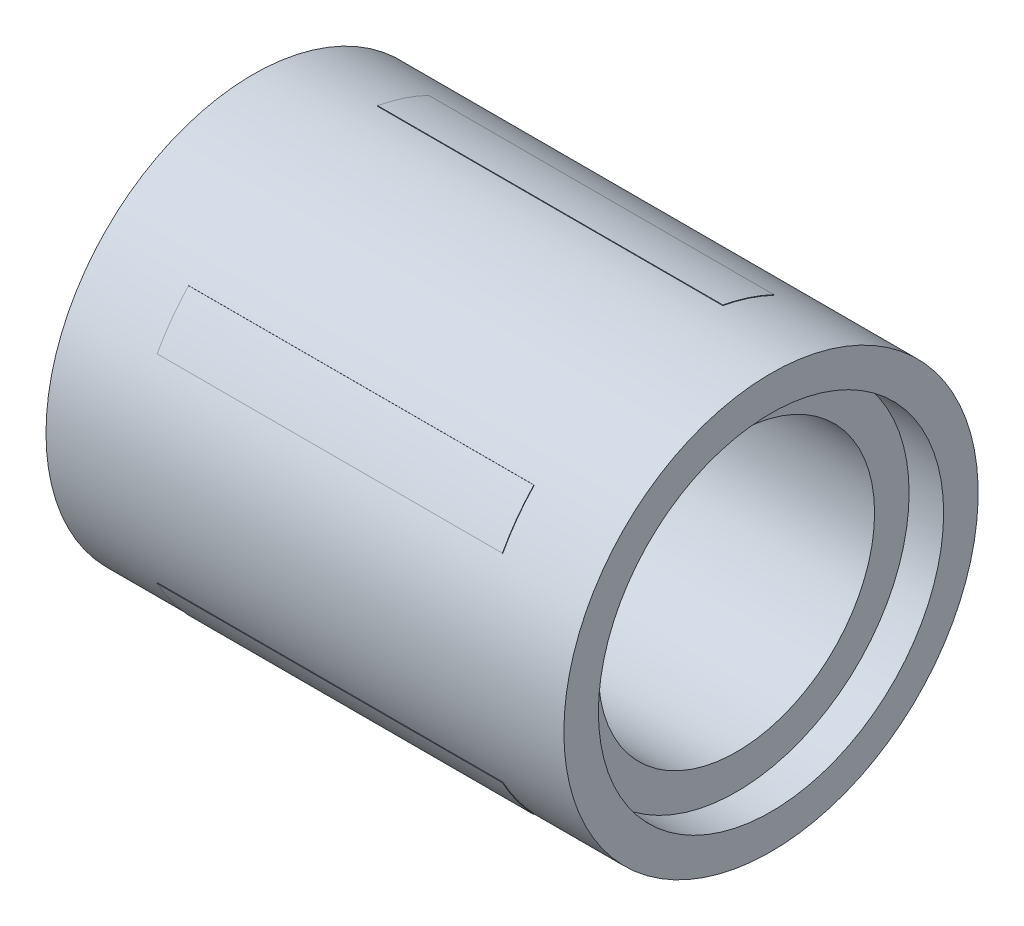
ISO-10303-21;
HEADER;
FILE_DESCRIPTION(('STEP AP214'),'2;1');
FILE_NAME('part.step','',(''),(''),'','','');
FILE_SCHEMA(('AUTOMOTIVE_DESIGN { 1 0 10303 214 1 1 1 1 }'));
ENDSEC;
DATA;
#1=APPLICATION_CONTEXT('core data for automotive mechanical design processes');
#2=APPLICATION_PROTOCOL_DEFINITION('international standard','automotive_design',2000,#1);
#3=PRODUCT_CONTEXT('',#1,'mechanical');
#4=PRODUCT('Part','Part','',(#3));
#5=PRODUCT_RELATED_PRODUCT_CATEGORY('part','',(#4));
#6=PRODUCT_DEFINITION_FORMATION('','',#4);
#7=PRODUCT_DEFINITION_CONTEXT('part definition',#1,'design');
#8=PRODUCT_DEFINITION('design','',#6,#7);
#9=PRODUCT_DEFINITION_SHAPE('','',#8);
#10=(LENGTH_UNIT() NAMED_UNIT(*) SI_UNIT(.MILLI.,.METRE.));
#11=(NAMED_UNIT(*) PLANE_ANGLE_UNIT() SI_UNIT($,.RADIAN.));
#12=(NAMED_UNIT(*) SI_UNIT($,.STERADIAN.) SOLID_ANGLE_UNIT());
#13=UNCERTAINTY_MEASURE_WITH_UNIT(LENGTH_MEASURE(1.E-05),#10,'distance_accuracy_value','');
#14=(GEOMETRIC_REPRESENTATION_CONTEXT(3) GLOBAL_UNCERTAINTY_ASSIGNED_CONTEXT((#13)) GLOBAL_UNIT_ASSIGNED_CONTEXT((#10,
#11,#12)) REPRESENTATION_CONTEXT('',''));
#15=CARTESIAN_POINT('',(0.,0.,0.));
#16=DIRECTION('',(0.,0.,1.));
#17=DIRECTION('',(1.,0.,0.));
#18=AXIS2_PLACEMENT_3D('',#15,#16,#17);
#19=CARTESIAN_POINT('',(-15.,12.,0.));
#20=DIRECTION('',(1.,0.,0.));
#21=DIRECTION('',(0.,0.,-1.));
#22=AXIS2_PLACEMENT_3D('',#19,#20,#21);
#23=PLANE('',#22);
#24=CARTESIAN_POINT('',(-15.,0.,0.));
#25=DIRECTION('',(-1.,0.,0.));
#26=DIRECTION('',(0.,0.,1.));
#27=AXIS2_PLACEMENT_3D('',#24,#25,#26);
#28=CIRCLE('',#27,10.);
#29=CARTESIAN_POINT('',(-15.,0.,10.));
#30=VERTEX_POINT('',#29);
#31=EDGE_CURVE('E302',#30,#30,#28,.T.);
#32=ORIENTED_EDGE('',*,*,#31,.F.);
#33=EDGE_LOOP('',(#32));
#34=FACE_BOUND('',#33,.T.);
#35=CARTESIAN_POINT('',(-15.,0.,0.));
#36=DIRECTION('',(-1.,0.,0.));
#37=DIRECTION('',(0.,0.,1.));
#38=AXIS2_PLACEMENT_3D('',#35,#36,#37);
#39=CIRCLE('',#38,12.);
#40=CARTESIAN_POINT('',(-15.,0.,12.));
#41=VERTEX_POINT('',#40);
#42=EDGE_CURVE('E185',#41,#41,#39,.T.);
#43=ORIENTED_EDGE('',*,*,#42,.T.);
#44=EDGE_LOOP('',(#43));
#45=FACE_BOUND('',#44,.T.);
#46=ADVANCED_FACE('F33',(#34,#45),#23,.F.);
#47=CARTESIAN_POINT('',(15.,0.,0.));
#48=DIRECTION('',(-1.,0.,0.));
#49=DIRECTION('',(0.,0.,1.));
#50=AXIS2_PLACEMENT_3D('',#47,#48,#49);
#51=CYLINDRICAL_SURFACE('',#50,10.);
#52=CARTESIAN_POINT('',(-13.,0.,0.));
#53=DIRECTION('',(-1.,0.,0.));
#54=DIRECTION('',(0.,0.,1.));
#55=AXIS2_PLACEMENT_3D('',#52,#53,#54);
#56=CIRCLE('',#55,10.);
#57=CARTESIAN_POINT('',(-13.,0.,10.));
#58=VERTEX_POINT('',#57);
#59=EDGE_CURVE('E299',#58,#58,#56,.T.);
#60=ORIENTED_EDGE('',*,*,#59,.F.);
#61=EDGE_LOOP('',(#60));
#62=FACE_BOUND('',#61,.T.);
#63=ORIENTED_EDGE('',*,*,#31,.T.);
#64=EDGE_LOOP('',(#63));
#65=FACE_BOUND('',#64,.T.);
#66=ADVANCED_FACE('F390',(#62,#65),#51,.F.);
#67=CARTESIAN_POINT('',(-13.,10.,0.));
#68=DIRECTION('',(1.,0.,0.));
#69=DIRECTION('',(0.,0.,-1.));
#70=AXIS2_PLACEMENT_3D('',#67,#68,#69);
#71=PLANE('',#70);
#72=CARTESIAN_POINT('',(-13.,0.,0.));
#73=DIRECTION('',(-1.,0.,0.));
#74=DIRECTION('',(0.,0.,1.));
#75=AXIS2_PLACEMENT_3D('',#72,#73,#74);
#76=CIRCLE('',#75,8.);
#77=CARTESIAN_POINT('',(-13.,0.,8.));
#78=VERTEX_POINT('',#77);
#79=EDGE_CURVE('E296',#78,#78,#76,.T.);
#80=ORIENTED_EDGE('',*,*,#79,.F.);
#81=EDGE_LOOP('',(#80));
#82=FACE_BOUND('',#81,.T.);
#83=ORIENTED_EDGE('',*,*,#59,.T.);
#84=EDGE_LOOP('',(#83));
#85=FACE_BOUND('',#84,.T.);
#86=ADVANCED_FACE('F395',(#82,#85),#71,.F.);
#87=CARTESIAN_POINT('',(15.,0.,0.));
#88=DIRECTION('',(-1.,0.,0.));
#89=DIRECTION('',(0.,0.,1.));
#90=AXIS2_PLACEMENT_3D('',#87,#88,#89);
#91=CYLINDRICAL_SURFACE('',#90,8.);
#92=CARTESIAN_POINT('',(13.,0.,0.));
#93=DIRECTION('',(-1.,0.,0.));
#94=DIRECTION('',(0.,0.,1.));
#95=AXIS2_PLACEMENT_3D('',#92,#93,#94);
#96=CIRCLE('',#95,8.);
#97=CARTESIAN_POINT('',(13.,0.,8.));
#98=VERTEX_POINT('',#97);
#99=EDGE_CURVE('E293',#98,#98,#96,.T.);
#100=ORIENTED_EDGE('',*,*,#99,.F.);
#101=EDGE_LOOP('',(#100));
#102=FACE_BOUND('',#101,.T.);
#103=ORIENTED_EDGE('',*,*,#79,.T.);
#104=EDGE_LOOP('',(#103));
#105=FACE_BOUND('',#104,.T.);
#106=ADVANCED_FACE('F422',(#102,#105),#91,.F.);
#107=CARTESIAN_POINT('',(13.,8.,0.));
#108=DIRECTION('',(-1.,0.,0.));
#109=DIRECTION('',(0.,0.,1.));
#110=AXIS2_PLACEMENT_3D('',#107,#108,#109);
#111=PLANE('',#110);
#112=CARTESIAN_POINT('',(13.,0.,0.));
#113=DIRECTION('',(-1.,0.,0.));
#114=DIRECTION('',(0.,0.,1.));
#115=AXIS2_PLACEMENT_3D('',#112,#113,#114);
#116=CIRCLE('',#115,10.);
#117=CARTESIAN_POINT('',(13.,0.,10.));
#118=VERTEX_POINT('',#117);
#119=EDGE_CURVE('E290',#118,#118,#116,.T.);
#120=ORIENTED_EDGE('',*,*,#119,.F.);
#121=EDGE_LOOP('',(#120));
#122=FACE_BOUND('',#121,.T.);
#123=ORIENTED_EDGE('',*,*,#99,.T.);
#124=EDGE_LOOP('',(#123));
#125=FACE_BOUND('',#124,.T.);
#126=ADVANCED_FACE('F416',(#122,#125),#111,.F.);
#127=CARTESIAN_POINT('',(15.,0.,0.));
#128=DIRECTION('',(-1.,0.,0.));
#129=DIRECTION('',(0.,0.,1.));
#130=AXIS2_PLACEMENT_3D('',#127,#128,#129);
#131=CYLINDRICAL_SURFACE('',#130,10.);
#132=CARTESIAN_POINT('',(15.,0.,0.));
#133=DIRECTION('',(-1.,0.,0.));
#134=DIRECTION('',(0.,0.,1.));
#135=AXIS2_PLACEMENT_3D('',#132,#133,#134);
#136=CIRCLE('',#135,10.);
#137=CARTESIAN_POINT('',(15.,0.,10.));
#138=VERTEX_POINT('',#137);
#139=EDGE_CURVE('E287',#138,#138,#136,.T.);
#140=ORIENTED_EDGE('',*,*,#139,.F.);
#141=EDGE_LOOP('',(#140));
#142=FACE_BOUND('',#141,.T.);
#143=ORIENTED_EDGE('',*,*,#119,.T.);
#144=EDGE_LOOP('',(#143));
#145=FACE_BOUND('',#144,.T.);
#146=ADVANCED_FACE('F410',(#142,#145),#131,.F.);
#147=CARTESIAN_POINT('',(15.,10.,0.));
#148=DIRECTION('',(-1.,0.,0.));
#149=DIRECTION('',(0.,0.,1.));
#150=AXIS2_PLACEMENT_3D('',#147,#148,#149);
#151=PLANE('',#150);
#152=CARTESIAN_POINT('',(15.,0.,0.));
#153=DIRECTION('',(-1.,0.,0.));
#154=DIRECTION('',(0.,0.,1.));
#155=AXIS2_PLACEMENT_3D('',#152,#153,#154);
#156=CIRCLE('',#155,12.);
#157=CARTESIAN_POINT('',(15.,0.,12.));
#158=VERTEX_POINT('',#157);
#159=EDGE_CURVE('E284',#158,#158,#156,.T.);
#160=ORIENTED_EDGE('',*,*,#159,.F.);
#161=EDGE_LOOP('',(#160));
#162=FACE_BOUND('',#161,.T.);
#163=ORIENTED_EDGE('',*,*,#139,.T.);
#164=EDGE_LOOP('',(#163));
#165=FACE_BOUND('',#164,.T.);
#166=ADVANCED_FACE('F404',(#162,#165),#151,.F.);
#167=CARTESIAN_POINT('',(15.,0.,0.));
#168=DIRECTION('',(-1.,0.,0.));
#169=DIRECTION('',(0.,0.,1.));
#170=AXIS2_PLACEMENT_3D('',#167,#168,#169);
#171=CYLINDRICAL_SURFACE('',#170,12.);
#172=DIRECTION('',(-1.,0.,0.));
#173=VECTOR('',#172,1.);
#174=CARTESIAN_POINT('',(15.,10.838096687135,-5.15127753089604));
#175=LINE('',#174,#173);
#176=CARTESIAN_POINT('',(10.,10.838096687135,-5.15127753089604));
#177=VERTEX_POINT('',#176);
#178=CARTESIAN_POINT('',(-10.,10.838096687135,-5.15127753089604));
#179=VERTEX_POINT('',#178);
#180=EDGE_CURVE('E36',#177,#179,#175,.T.);
#181=ORIENTED_EDGE('',*,*,#180,.F.);
#182=CARTESIAN_POINT('',(10.,0.,0.));
#183=DIRECTION('',(1.,0.,0.));
#184=DIRECTION('',(0.,0.,-1.));
#185=AXIS2_PLACEMENT_3D('',#182,#183,#184);
#186=CIRCLE('',#185,12.);
#187=CARTESIAN_POINT('',(10.,11.7960493696973,-2.20300233038115));
#188=VERTEX_POINT('',#187);
#189=EDGE_CURVE('E11',#177,#188,#186,.T.);
#190=ORIENTED_EDGE('',*,*,#189,.T.);
#191=DIRECTION('',(-1.,0.,0.));
#192=VECTOR('',#191,1.);
#193=CARTESIAN_POINT('',(15.,11.7960493696973,-2.20300233038115));
#194=LINE('',#193,#192);
#195=CARTESIAN_POINT('',(-10.,11.7960493696973,-2.20300233038115));
#196=VERTEX_POINT('',#195);
#197=EDGE_CURVE('E335',#196,#188,#194,.F.);
#198=ORIENTED_EDGE('',*,*,#197,.F.);
#199=CARTESIAN_POINT('',(-10.,0.,0.));
#200=DIRECTION('',(1.,0.,0.));
#201=DIRECTION('',(0.,0.,-1.));
#202=AXIS2_PLACEMENT_3D('',#199,#200,#201);
#203=CIRCLE('',#202,12.);
#204=EDGE_CURVE('E309',#179,#196,#203,.T.);
#205=ORIENTED_EDGE('',*,*,#204,.F.);
#206=EDGE_LOOP('',(#181,#190,#198,#205));
#207=FACE_BOUND('',#206,.T.);
#208=DIRECTION('',(-1.,0.,0.));
#209=VECTOR('',#208,1.);
#210=CARTESIAN_POINT('',(15.,8.24831212600703,8.7158101787479));
#211=LINE('',#210,#209);
#212=CARTESIAN_POINT('',(10.,8.24831212600703,8.7158101787479));
#213=VERTEX_POINT('',#212);
#214=CARTESIAN_POINT('',(-10.,8.24831212600703,8.7158101787479));
#215=VERTEX_POINT('',#214);
#216=EDGE_CURVE('E332',#213,#215,#211,.T.);
#217=ORIENTED_EDGE('',*,*,#216,.F.);
#218=CARTESIAN_POINT('',(10.,5.74035944344453,10.5379444608546));
#219=VERTEX_POINT('',#218);
#220=EDGE_CURVE('E42',#213,#219,#186,.T.);
#221=ORIENTED_EDGE('',*,*,#220,.T.);
#222=DIRECTION('',(-1.,0.,0.));
#223=VECTOR('',#222,1.);
#224=CARTESIAN_POINT('',(15.,5.74035944344453,10.5379444608546));
#225=LINE('',#224,#223);
#226=CARTESIAN_POINT('',(-10.,5.74035944344453,10.5379444608546));
#227=VERTEX_POINT('',#226);
#228=EDGE_CURVE('E329',#227,#219,#225,.F.);
#229=ORIENTED_EDGE('',*,*,#228,.F.);
#230=EDGE_CURVE('E333',#215,#227,#203,.T.);
#231=ORIENTED_EDGE('',*,*,#230,.F.);
#232=EDGE_LOOP('',(#217,#221,#229,#231));
#233=FACE_BOUND('',#232,.T.);
#234=DIRECTION('',(-1.,0.,0.));
#235=VECTOR('',#234,1.);
#236=CARTESIAN_POINT('',(15.,-5.74035944344453,10.5379444608546));
#237=LINE('',#236,#235);
#238=CARTESIAN_POINT('',(10.,-5.74035944344453,10.5379444608546));
#239=VERTEX_POINT('',#238);
#240=CARTESIAN_POINT('',(-10.,-5.74035944344453,10.5379444608546));
#241=VERTEX_POINT('',#240);
#242=EDGE_CURVE('E174',#239,#241,#237,.T.);
#243=ORIENTED_EDGE('',*,*,#242,.F.);
#244=CARTESIAN_POINT('',(10.,-8.24831212600703,8.7158101787479));
#245=VERTEX_POINT('',#244);
#246=EDGE_CURVE('E328',#239,#245,#186,.T.);
#247=ORIENTED_EDGE('',*,*,#246,.T.);
#248=DIRECTION('',(-1.,0.,0.));
#249=VECTOR('',#248,1.);
#250=CARTESIAN_POINT('',(15.,-8.24831212600703,8.7158101787479));
#251=LINE('',#250,#249);
#252=CARTESIAN_POINT('',(-10.,-8.24831212600703,8.7158101787479));
#253=VERTEX_POINT('',#252);
#254=EDGE_CURVE('E323',#253,#245,#251,.F.);
#255=ORIENTED_EDGE('',*,*,#254,.F.);
#256=EDGE_CURVE('E326',#241,#253,#203,.T.);
#257=ORIENTED_EDGE('',*,*,#256,.F.);
#258=EDGE_LOOP('',(#243,#247,#255,#257));
#259=FACE_BOUND('',#258,.T.);
#260=DIRECTION('',(-1.,0.,0.));
#261=VECTOR('',#260,1.);
#262=CARTESIAN_POINT('',(15.,-11.7960493696973,-2.20300233038115));
#263=LINE('',#262,#261);
#264=CARTESIAN_POINT('',(10.,-11.7960493696973,-2.20300233038115));
#265=VERTEX_POINT('',#264);
#266=CARTESIAN_POINT('',(-10.,-11.7960493696973,-2.20300233038115));
#267=VERTEX_POINT('',#266);
#268=EDGE_CURVE('E320',#265,#267,#263,.T.);
#269=ORIENTED_EDGE('',*,*,#268,.F.);
#270=CARTESIAN_POINT('',(10.,-10.838096687135,-5.15127753089604));
#271=VERTEX_POINT('',#270);
#272=EDGE_CURVE('E316',#265,#271,#186,.T.);
#273=ORIENTED_EDGE('',*,*,#272,.T.);
#274=DIRECTION('',(-1.,0.,0.));
#275=VECTOR('',#274,1.);
#276=CARTESIAN_POINT('',(15.,-10.838096687135,-5.15127753089604));
#277=LINE('',#276,#275);
#278=CARTESIAN_POINT('',(-10.,-10.838096687135,-5.15127753089604));
#279=VERTEX_POINT('',#278);
#280=EDGE_CURVE('E317',#279,#271,#277,.F.);
#281=ORIENTED_EDGE('',*,*,#280,.F.);
#282=EDGE_CURVE('E310',#267,#279,#203,.T.);
#283=ORIENTED_EDGE('',*,*,#282,.F.);
#284=EDGE_LOOP('',(#269,#273,#281,#283));
#285=FACE_BOUND('',#284,.T.);
#286=DIRECTION('',(-1.,0.,0.));
#287=VECTOR('',#286,1.);
#288=CARTESIAN_POINT('',(15.,-1.55,-11.8994747783253));
#289=LINE('',#288,#287);
#290=CARTESIAN_POINT('',(10.,-1.55,-11.8994747783253));
#291=VERTEX_POINT('',#290);
#292=CARTESIAN_POINT('',(-10.,-1.55,-11.8994747783253));
#293=VERTEX_POINT('',#292);
#294=EDGE_CURVE('E313',#291,#293,#289,.T.);
#295=ORIENTED_EDGE('',*,*,#294,.F.);
#296=CARTESIAN_POINT('',(10.,1.55,-11.8994747783253));
#297=VERTEX_POINT('',#296);
#298=EDGE_CURVE('E43',#291,#297,#186,.T.);
#299=ORIENTED_EDGE('',*,*,#298,.T.);
#300=DIRECTION('',(-1.,0.,0.));
#301=VECTOR('',#300,1.);
#302=CARTESIAN_POINT('',(15.,1.55,-11.8994747783253));
#303=LINE('',#302,#301);
#304=CARTESIAN_POINT('',(-10.,1.55,-11.8994747783253));
#305=VERTEX_POINT('',#304);
#306=EDGE_CURVE('E308',#305,#297,#303,.F.);
#307=ORIENTED_EDGE('',*,*,#306,.F.);
#308=EDGE_CURVE('E305',#293,#305,#203,.T.);
#309=ORIENTED_EDGE('',*,*,#308,.F.);
#310=EDGE_LOOP('',(#295,#299,#307,#309));
#311=FACE_BOUND('',#310,.T.);
#312=ORIENTED_EDGE('',*,*,#42,.F.);
#313=EDGE_LOOP('',(#312));
#314=FACE_BOUND('',#313,.T.);
#315=ORIENTED_EDGE('',*,*,#159,.T.);
#316=EDGE_LOOP('',(#315));
#317=FACE_BOUND('',#316,.T.);
#318=ADVANCED_FACE('F365',(#207,#233,#259,#285,#311,#314,#317),#171,.T.);
#319=CARTESIAN_POINT('',(10.,0.,-2.79984369022657E-12));
#320=DIRECTION('',(-1.,0.,0.));
#321=DIRECTION('',(0.,0.,1.));
#322=AXIS2_PLACEMENT_3D('',#319,#320,#321);
#323=CYLINDRICAL_SURFACE('',#322,12.0299999999971);
#324=DIRECTION('',(-1.,0.,0.));
#325=VECTOR('',#324,1.);
#326=CARTESIAN_POINT('',(10.,-1.55000000000001,-11.929727574425));
#327=LINE('',#326,#325);
#328=CARTESIAN_POINT('',(10.,-1.55000000000001,-11.929727574425));
#329=VERTEX_POINT('',#328);
#330=CARTESIAN_POINT('',(-10.,-1.55000000000001,-11.929727574425));
#331=VERTEX_POINT('',#330);
#332=EDGE_CURVE('E273',#329,#331,#327,.T.);
#333=ORIENTED_EDGE('',*,*,#332,.T.);
#334=CARTESIAN_POINT('',(-10.,0.,-2.79984369022657E-12));
#335=DIRECTION('',(1.,0.,0.));
#336=DIRECTION('',(0.,0.,-1.));
#337=AXIS2_PLACEMENT_3D('',#334,#335,#336);
#338=CIRCLE('',#337,12.0299999999971);
#339=CARTESIAN_POINT('',(-10.,1.55,-11.929727574425));
#340=VERTEX_POINT('',#339);
#341=EDGE_CURVE('E205',#331,#340,#338,.T.);
#342=ORIENTED_EDGE('',*,*,#341,.T.);
#343=DIRECTION('',(-1.,0.,0.));
#344=VECTOR('',#343,1.);
#345=CARTESIAN_POINT('',(10.,1.55,-11.929727574425));
#346=LINE('',#345,#344);
#347=CARTESIAN_POINT('',(10.,1.55,-11.929727574425));
#348=VERTEX_POINT('',#347);
#349=EDGE_CURVE('E271',#348,#340,#346,.T.);
#350=ORIENTED_EDGE('',*,*,#349,.F.);
#351=CARTESIAN_POINT('',(10.,0.,-2.79984369022657E-12));
#352=DIRECTION('',(1.,0.,0.));
#353=DIRECTION('',(0.,0.,-1.));
#354=AXIS2_PLACEMENT_3D('',#351,#352,#353);
#355=CIRCLE('',#354,12.0299999999971);
#356=EDGE_CURVE('E242',#329,#348,#355,.T.);
#357=ORIENTED_EDGE('',*,*,#356,.F.);
#358=EDGE_LOOP('',(#333,#342,#350,#357));
#359=FACE_BOUND('',#358,.T.);
#360=ADVANCED_FACE('F403',(#359),#323,.T.);
#361=CARTESIAN_POINT('',(-10.,0.,-2.79984369022657E-12));
#362=DIRECTION('',(1.,0.,0.));
#363=DIRECTION('',(0.,0.,-1.));
#364=AXIS2_PLACEMENT_3D('',#361,#362,#363);
#365=PLANE('',#364);
#366=DIRECTION('',(0.,0.,-1.));
#367=VECTOR('',#366,1.);
#368=CARTESIAN_POINT('',(-10.,-1.55,-11.395064721185));
#369=LINE('',#368,#367);
#370=EDGE_CURVE('E203',#293,#331,#369,.T.);
#371=ORIENTED_EDGE('',*,*,#370,.F.);
#372=ORIENTED_EDGE('',*,*,#308,.T.);
#373=DIRECTION('',(0.,0.,1.));
#374=VECTOR('',#373,1.);
#375=CARTESIAN_POINT('',(-10.,1.55,-11.929727574425));
#376=LINE('',#375,#374);
#377=EDGE_CURVE('E208',#340,#305,#376,.T.);
#378=ORIENTED_EDGE('',*,*,#377,.F.);
#379=ORIENTED_EDGE('',*,*,#341,.F.);
#380=EDGE_LOOP('',(#371,#372,#378,#379));
#381=FACE_BOUND('',#380,.T.);
#382=ADVANCED_FACE('F455',(#381),#365,.F.);
#383=CARTESIAN_POINT('',(10.,1.55,-11.929727574425));
#384=DIRECTION('',(0.,-1.,0.));
#385=DIRECTION('',(0.,0.,-1.));
#386=AXIS2_PLACEMENT_3D('',#383,#384,#385);
#387=PLANE('',#386);
#388=ORIENTED_EDGE('',*,*,#377,.T.);
#389=ORIENTED_EDGE('',*,*,#306,.T.);
#390=DIRECTION('',(0.,0.,1.));
#391=VECTOR('',#390,1.);
#392=CARTESIAN_POINT('',(10.,1.55,-11.929727574425));
#393=LINE('',#392,#391);
#394=EDGE_CURVE('E244',#348,#297,#393,.T.);
#395=ORIENTED_EDGE('',*,*,#394,.F.);
#396=ORIENTED_EDGE('',*,*,#349,.T.);
#397=EDGE_LOOP('',(#388,#389,#395,#396));
#398=FACE_BOUND('',#397,.T.);
#399=ADVANCED_FACE('F451',(#398),#387,.F.);
#400=CARTESIAN_POINT('',(10.,-1.55,-11.395064721185));
#401=DIRECTION('',(0.,1.,0.));
#402=DIRECTION('',(0.,0.,1.));
#403=AXIS2_PLACEMENT_3D('',#400,#401,#402);
#404=PLANE('',#403);
#405=DIRECTION('',(0.,0.,-1.));
#406=VECTOR('',#405,1.);
#407=CARTESIAN_POINT('',(10.,-1.55,-11.395064721185));
#408=LINE('',#407,#406);
#409=EDGE_CURVE('E240',#291,#329,#408,.T.);
#410=ORIENTED_EDGE('',*,*,#409,.F.);
#411=ORIENTED_EDGE('',*,*,#294,.T.);
#412=ORIENTED_EDGE('',*,*,#370,.T.);
#413=ORIENTED_EDGE('',*,*,#332,.F.);
#414=EDGE_LOOP('',(#410,#411,#412,#413));
#415=FACE_BOUND('',#414,.T.);
#416=ADVANCED_FACE('F382',(#415),#404,.F.);
#417=CARTESIAN_POINT('',(10.,0.,-2.79984369022657E-12));
#418=DIRECTION('',(1.,0.,0.));
#419=DIRECTION('',(0.,0.,-1.));
#420=AXIS2_PLACEMENT_3D('',#417,#418,#419);
#421=PLANE('',#420);
#422=ORIENTED_EDGE('',*,*,#298,.F.);
#423=ORIENTED_EDGE('',*,*,#409,.T.);
#424=ORIENTED_EDGE('',*,*,#356,.T.);
#425=ORIENTED_EDGE('',*,*,#394,.T.);
#426=EDGE_LOOP('',(#422,#423,#424,#425));
#427=FACE_BOUND('',#426,.T.);
#428=ADVANCED_FACE('F371',(#427),#421,.T.);
#429=CARTESIAN_POINT('',(10.,0.,-2.79984369022657E-12));
#430=DIRECTION('',(-1.,0.,0.));
#431=DIRECTION('',(0.,0.,1.));
#432=AXIS2_PLACEMENT_3D('',#429,#430,#431);
#433=CYLINDRICAL_SURFACE('',#432,12.0299999999991);
#434=DIRECTION('',(-1.,0.,0.));
#435=VECTOR('',#434,1.);
#436=CARTESIAN_POINT('',(10.,-11.8248214885638,-2.21235095850326));
#437=LINE('',#436,#435);
#438=CARTESIAN_POINT('',(10.,-11.8248214885638,-2.21235095850326));
#439=VERTEX_POINT('',#438);
#440=CARTESIAN_POINT('',(-10.,-11.8248214885638,-2.21235095850326));
#441=VERTEX_POINT('',#440);
#442=EDGE_CURVE('E278',#439,#441,#437,.T.);
#443=ORIENTED_EDGE('',*,*,#442,.T.);
#444=CARTESIAN_POINT('',(-10.,0.,-2.79984369022657E-12));
#445=DIRECTION('',(1.,0.,0.));
#446=DIRECTION('',(0.,0.,-1.));
#447=AXIS2_PLACEMENT_3D('',#444,#445,#446);
#448=CIRCLE('',#447,12.0299999999991);
#449=CARTESIAN_POINT('',(-10.,-10.866868806002,-5.1606261590183));
#450=VERTEX_POINT('',#449);
#451=EDGE_CURVE('E197',#441,#450,#448,.T.);
#452=ORIENTED_EDGE('',*,*,#451,.T.);
#453=DIRECTION('',(-1.,0.,0.));
#454=VECTOR('',#453,1.);
#455=CARTESIAN_POINT('',(10.,-10.866868806002,-5.1606261590183));
#456=LINE('',#455,#454);
#457=CARTESIAN_POINT('',(10.,-10.866868806002,-5.1606261590183));
#458=VERTEX_POINT('',#457);
#459=EDGE_CURVE('E276',#458,#450,#456,.T.);
#460=ORIENTED_EDGE('',*,*,#459,.F.);
#461=CARTESIAN_POINT('',(10.,0.,-2.79984369022657E-12));
#462=DIRECTION('',(1.,0.,0.));
#463=DIRECTION('',(0.,0.,-1.));
#464=AXIS2_PLACEMENT_3D('',#461,#462,#463);
#465=CIRCLE('',#464,12.0299999999991);
#466=EDGE_CURVE('E235',#439,#458,#465,.T.);
#467=ORIENTED_EDGE('',*,*,#466,.F.);
#468=EDGE_LOOP('',(#443,#452,#460,#467));
#469=FACE_BOUND('',#468,.T.);
#470=ADVANCED_FACE('F359',(#469),#433,.T.);
#471=DIRECTION('',(0.,-0.95105651629521,-0.309016994374772));
#472=VECTOR('',#471,1.);
#473=CARTESIAN_POINT('',(-10.,-11.316326897969,-2.0471310505912));
#474=LINE('',#473,#472);
#475=EDGE_CURVE('E193',#267,#441,#474,.T.);
#476=ORIENTED_EDGE('',*,*,#475,.F.);
#477=ORIENTED_EDGE('',*,*,#282,.T.);
#478=DIRECTION('',(0.,0.951056516295156,0.309016994374941));
#479=VECTOR('',#478,1.);
#480=CARTESIAN_POINT('',(-10.,-10.866868806002,-5.1606261590183));
#481=LINE('',#480,#479);
#482=EDGE_CURVE('E200',#450,#279,#481,.T.);
#483=ORIENTED_EDGE('',*,*,#482,.F.);
#484=ORIENTED_EDGE('',*,*,#451,.F.);
#485=EDGE_LOOP('',(#476,#477,#483,#484));
#486=FACE_BOUND('',#485,.T.);
#487=ADVANCED_FACE('F350',(#486),#365,.F.);
#488=CARTESIAN_POINT('',(10.,-10.866868806002,-5.1606261590183));
#489=DIRECTION('',(0.,-0.309016994374941,0.951056516295156));
#490=DIRECTION('',(0.,-0.951056516295156,-0.309016994374941));
#491=AXIS2_PLACEMENT_3D('',#488,#489,#490);
#492=PLANE('',#491);
#493=ORIENTED_EDGE('',*,*,#482,.T.);
#494=ORIENTED_EDGE('',*,*,#280,.T.);
#495=DIRECTION('',(0.,0.951056516295156,0.309016994374941));
#496=VECTOR('',#495,1.);
#497=CARTESIAN_POINT('',(10.,-10.866868806002,-5.1606261590183));
#498=LINE('',#497,#496);
#499=EDGE_CURVE('E237',#458,#271,#498,.T.);
#500=ORIENTED_EDGE('',*,*,#499,.F.);
#501=ORIENTED_EDGE('',*,*,#459,.T.);
#502=EDGE_LOOP('',(#493,#494,#500,#501));
#503=FACE_BOUND('',#502,.T.);
#504=ADVANCED_FACE('F354',(#503),#492,.F.);
#505=CARTESIAN_POINT('',(10.,-11.316326897969,-2.0471310505912));
#506=DIRECTION('',(0.,0.309016994374772,-0.95105651629521));
#507=DIRECTION('',(0.,0.95105651629521,0.309016994374772));
#508=AXIS2_PLACEMENT_3D('',#505,#506,#507);
#509=PLANE('',#508);
#510=DIRECTION('',(0.,-0.95105651629521,-0.309016994374772));
#511=VECTOR('',#510,1.);
#512=CARTESIAN_POINT('',(10.,-11.316326897969,-2.0471310505912));
#513=LINE('',#512,#511);
#514=EDGE_CURVE('E233',#265,#439,#513,.T.);
#515=ORIENTED_EDGE('',*,*,#514,.F.);
#516=ORIENTED_EDGE('',*,*,#268,.T.);
#517=ORIENTED_EDGE('',*,*,#475,.T.);
#518=ORIENTED_EDGE('',*,*,#442,.F.);
#519=EDGE_LOOP('',(#515,#516,#517,#518));
#520=FACE_BOUND('',#519,.T.);
#521=ADVANCED_FACE('F363',(#520),#509,.F.);
#522=ORIENTED_EDGE('',*,*,#272,.F.);
#523=ORIENTED_EDGE('',*,*,#514,.T.);
#524=ORIENTED_EDGE('',*,*,#466,.T.);
#525=ORIENTED_EDGE('',*,*,#499,.T.);
#526=EDGE_LOOP('',(#522,#523,#524,#525));
#527=FACE_BOUND('',#526,.T.);
#528=ADVANCED_FACE('F368',(#527),#421,.T.);
#529=CARTESIAN_POINT('',(10.,0.,-2.79984369022657E-12));
#530=DIRECTION('',(-1.,0.,0.));
#531=DIRECTION('',(0.,0.,1.));
#532=AXIS2_PLACEMENT_3D('',#529,#530,#531);
#533=CYLINDRICAL_SURFACE('',#532,12.0300000000023);
#534=DIRECTION('',(-1.,0.,0.));
#535=VECTOR('',#534,1.);
#536=CARTESIAN_POINT('',(10.,-5.75814159083262,10.5624194870267));
#537=LINE('',#536,#535);
#538=CARTESIAN_POINT('',(10.,-5.75814159083262,10.5624194870267));
#539=VERTEX_POINT('',#538);
#540=CARTESIAN_POINT('',(-10.,-5.75814159083262,10.5624194870267));
#541=VERTEX_POINT('',#540);
#542=EDGE_CURVE('E172',#539,#541,#537,.T.);
#543=ORIENTED_EDGE('',*,*,#542,.T.);
#544=CARTESIAN_POINT('',(-10.,0.,-2.79984369022657E-12));
#545=DIRECTION('',(1.,0.,0.));
#546=DIRECTION('',(0.,0.,-1.));
#547=AXIS2_PLACEMENT_3D('',#544,#545,#546);
#548=CIRCLE('',#547,12.0300000000023);
#549=CARTESIAN_POINT('',(-10.,-8.2660942733951,8.74028520492));
#550=VERTEX_POINT('',#549);
#551=EDGE_CURVE('E178',#541,#550,#548,.T.);
#552=ORIENTED_EDGE('',*,*,#551,.T.);
#553=DIRECTION('',(-1.,0.,0.));
#554=VECTOR('',#553,1.);
#555=CARTESIAN_POINT('',(10.,-8.2660942733951,8.74028520492));
#556=LINE('',#555,#554);
#557=CARTESIAN_POINT('',(10.,-8.2660942733951,8.74028520492));
#558=VERTEX_POINT('',#557);
#559=EDGE_CURVE('E186',#558,#550,#556,.T.);
#560=ORIENTED_EDGE('',*,*,#559,.F.);
#561=CARTESIAN_POINT('',(10.,0.,-2.79984369022657E-12));
#562=DIRECTION('',(1.,0.,0.));
#563=DIRECTION('',(0.,0.,-1.));
#564=AXIS2_PLACEMENT_3D('',#561,#562,#563);
#565=CIRCLE('',#564,12.0300000000023);
#566=EDGE_CURVE('E184',#539,#558,#565,.T.);
#567=ORIENTED_EDGE('',*,*,#566,.F.);
#568=EDGE_LOOP('',(#543,#552,#560,#567));
#569=FACE_BOUND('',#568,.T.);
#570=ADVANCED_FACE('F182',(#569),#533,.T.);
#571=DIRECTION('',(0.,-0.587785252292629,0.809016994374834));
#572=VECTOR('',#571,1.);
#573=CARTESIAN_POINT('',(-10.,-5.4438746507497,10.129868152495));
#574=LINE('',#573,#572);
#575=EDGE_CURVE('E168',#241,#541,#574,.T.);
#576=ORIENTED_EDGE('',*,*,#575,.F.);
#577=ORIENTED_EDGE('',*,*,#256,.T.);
#578=DIRECTION('',(0.,0.587785252292419,-0.809016994374987));
#579=VECTOR('',#578,1.);
#580=CARTESIAN_POINT('',(-10.,-8.2660942733951,8.74028520492));
#581=LINE('',#580,#579);
#582=EDGE_CURVE('E191',#550,#253,#581,.T.);
#583=ORIENTED_EDGE('',*,*,#582,.F.);
#584=ORIENTED_EDGE('',*,*,#551,.F.);
#585=EDGE_LOOP('',(#576,#577,#583,#584));
#586=FACE_BOUND('',#585,.T.);
#587=ADVANCED_FACE('F189',(#586),#365,.F.);
#588=CARTESIAN_POINT('',(10.,-8.2660942733951,8.74028520492));
#589=DIRECTION('',(0.,0.809016994374987,0.587785252292419));
#590=DIRECTION('',(0.,-0.587785252292419,0.809016994374987));
#591=AXIS2_PLACEMENT_3D('',#588,#589,#590);
#592=PLANE('',#591);
#593=ORIENTED_EDGE('',*,*,#582,.T.);
#594=ORIENTED_EDGE('',*,*,#254,.T.);
#595=DIRECTION('',(0.,0.587785252292419,-0.809016994374987));
#596=VECTOR('',#595,1.);
#597=CARTESIAN_POINT('',(10.,-8.2660942733951,8.74028520492));
#598=LINE('',#597,#596);
#599=EDGE_CURVE('E230',#558,#245,#598,.T.);
#600=ORIENTED_EDGE('',*,*,#599,.F.);
#601=ORIENTED_EDGE('',*,*,#559,.T.);
#602=EDGE_LOOP('',(#593,#594,#600,#601));
#603=FACE_BOUND('',#602,.T.);
#604=ADVANCED_FACE('F440',(#603),#592,.F.);
#605=CARTESIAN_POINT('',(10.,-5.4438746507497,10.129868152495));
#606=DIRECTION('',(0.,-0.809016994374834,-0.587785252292629));
#607=DIRECTION('',(0.,0.587785252292629,-0.809016994374834));
#608=AXIS2_PLACEMENT_3D('',#605,#606,#607);
#609=PLANE('',#608);
#610=DIRECTION('',(0.,-0.587785252292629,0.809016994374834));
#611=VECTOR('',#610,1.);
#612=CARTESIAN_POINT('',(10.,-5.4438746507497,10.129868152495));
#613=LINE('',#612,#611);
#614=EDGE_CURVE('E227',#239,#539,#613,.T.);
#615=ORIENTED_EDGE('',*,*,#614,.F.);
#616=ORIENTED_EDGE('',*,*,#242,.T.);
#617=ORIENTED_EDGE('',*,*,#575,.T.);
#618=ORIENTED_EDGE('',*,*,#542,.F.);
#619=EDGE_LOOP('',(#615,#616,#617,#618));
#620=FACE_BOUND('',#619,.T.);
#621=ADVANCED_FACE('F171',(#620),#609,.F.);
#622=ORIENTED_EDGE('',*,*,#246,.F.);
#623=ORIENTED_EDGE('',*,*,#614,.T.);
#624=ORIENTED_EDGE('',*,*,#566,.T.);
#625=ORIENTED_EDGE('',*,*,#599,.T.);
#626=EDGE_LOOP('',(#622,#623,#624,#625));
#627=FACE_BOUND('',#626,.T.);
#628=ADVANCED_FACE('F372',(#627),#421,.T.);
#629=CARTESIAN_POINT('',(10.,0.,-2.79984369022657E-12));
#630=DIRECTION('',(-1.,0.,0.));
#631=DIRECTION('',(0.,0.,1.));
#632=AXIS2_PLACEMENT_3D('',#629,#630,#631);
#633=CYLINDRICAL_SURFACE('',#632,12.0300000000024);
#634=DIRECTION('',(-1.,0.,0.));
#635=VECTOR('',#634,1.);
#636=CARTESIAN_POINT('',(10.,8.26609427339535,8.74028520492027));
#637=LINE('',#636,#635);
#638=CARTESIAN_POINT('',(10.,8.26609427339535,8.74028520492027));
#639=VERTEX_POINT('',#638);
#640=CARTESIAN_POINT('',(-10.,8.26609427339535,8.74028520492027));
#641=VERTEX_POINT('',#640);
#642=EDGE_CURVE('E263',#639,#641,#637,.T.);
#643=ORIENTED_EDGE('',*,*,#642,.T.);
#644=CARTESIAN_POINT('',(-10.,0.,-2.79984369022657E-12));
#645=DIRECTION('',(1.,0.,0.));
#646=DIRECTION('',(0.,0.,-1.));
#647=AXIS2_PLACEMENT_3D('',#644,#645,#646);
#648=CIRCLE('',#647,12.0300000000024);
#649=CARTESIAN_POINT('',(-10.,5.7581415908328,10.562419487027));
#650=VERTEX_POINT('',#649);
#651=EDGE_CURVE('E221',#641,#650,#648,.T.);
#652=ORIENTED_EDGE('',*,*,#651,.T.);
#653=DIRECTION('',(-1.,0.,0.));
#654=VECTOR('',#653,1.);
#655=CARTESIAN_POINT('',(10.,5.7581415908328,10.562419487027));
#656=LINE('',#655,#654);
#657=CARTESIAN_POINT('',(10.,5.7581415908328,10.562419487027));
#658=VERTEX_POINT('',#657);
#659=EDGE_CURVE('E261',#658,#650,#656,.T.);
#660=ORIENTED_EDGE('',*,*,#659,.F.);
#661=CARTESIAN_POINT('',(10.,0.,-2.79984369022657E-12));
#662=DIRECTION('',(1.,0.,0.));
#663=DIRECTION('',(0.,0.,-1.));
#664=AXIS2_PLACEMENT_3D('',#661,#662,#663);
#665=CIRCLE('',#664,12.0300000000024);
#666=EDGE_CURVE('E256',#639,#658,#665,.T.);
#667=ORIENTED_EDGE('',*,*,#666,.F.);
#668=EDGE_LOOP('',(#643,#652,#660,#667));
#669=FACE_BOUND('',#668,.T.);
#670=ADVANCED_FACE('F386',(#669),#633,.T.);
#671=DIRECTION('',(0.,0.587785252292419,0.809016994374987));
#672=VECTOR('',#671,1.);
#673=CARTESIAN_POINT('',(-10.,7.9518273333121,8.3077338703879));
#674=LINE('',#673,#672);
#675=EDGE_CURVE('E219',#215,#641,#674,.T.);
#676=ORIENTED_EDGE('',*,*,#675,.F.);
#677=ORIENTED_EDGE('',*,*,#230,.T.);
#678=DIRECTION('',(0.,-0.587785252292629,-0.809016994374834));
#679=VECTOR('',#678,1.);
#680=CARTESIAN_POINT('',(-10.,5.7581415908328,10.562419487027));
#681=LINE('',#680,#679);
#682=EDGE_CURVE('E224',#650,#227,#681,.T.);
#683=ORIENTED_EDGE('',*,*,#682,.F.);
#684=ORIENTED_EDGE('',*,*,#651,.F.);
#685=EDGE_LOOP('',(#676,#677,#683,#684));
#686=FACE_BOUND('',#685,.T.);
#687=ADVANCED_FACE('F478',(#686),#365,.F.);
#688=CARTESIAN_POINT('',(10.,5.7581415908328,10.562419487027));
#689=DIRECTION('',(0.,0.809016994374834,-0.587785252292629));
#690=DIRECTION('',(0.,0.587785252292629,0.809016994374834));
#691=AXIS2_PLACEMENT_3D('',#688,#689,#690);
#692=PLANE('',#691);
#693=ORIENTED_EDGE('',*,*,#682,.T.);
#694=ORIENTED_EDGE('',*,*,#228,.T.);
#695=DIRECTION('',(0.,-0.587785252292629,-0.809016994374834));
#696=VECTOR('',#695,1.);
#697=CARTESIAN_POINT('',(10.,5.7581415908328,10.562419487027));
#698=LINE('',#697,#696);
#699=EDGE_CURVE('E258',#658,#219,#698,.T.);
#700=ORIENTED_EDGE('',*,*,#699,.F.);
#701=ORIENTED_EDGE('',*,*,#659,.T.);
#702=EDGE_LOOP('',(#693,#694,#700,#701));
#703=FACE_BOUND('',#702,.T.);
#704=ADVANCED_FACE('F475',(#703),#692,.F.);
#705=CARTESIAN_POINT('',(10.,7.9518273333121,8.3077338703879));
#706=DIRECTION('',(0.,-0.809016994374987,0.587785252292419));
#707=DIRECTION('',(0.,-0.587785252292419,-0.809016994374987));
#708=AXIS2_PLACEMENT_3D('',#705,#706,#707);
#709=PLANE('',#708);
#710=DIRECTION('',(0.,0.587785252292419,0.809016994374987));
#711=VECTOR('',#710,1.);
#712=CARTESIAN_POINT('',(10.,7.9518273333121,8.3077338703879));
#713=LINE('',#712,#711);
#714=EDGE_CURVE('E254',#213,#639,#713,.T.);
#715=ORIENTED_EDGE('',*,*,#714,.F.);
#716=ORIENTED_EDGE('',*,*,#216,.T.);
#717=ORIENTED_EDGE('',*,*,#675,.T.);
#718=ORIENTED_EDGE('',*,*,#642,.F.);
#719=EDGE_LOOP('',(#715,#716,#717,#718));
#720=FACE_BOUND('',#719,.T.);
#721=ADVANCED_FACE('F472',(#720),#709,.F.);
#722=ORIENTED_EDGE('',*,*,#220,.F.);
#723=ORIENTED_EDGE('',*,*,#714,.T.);
#724=ORIENTED_EDGE('',*,*,#666,.T.);
#725=ORIENTED_EDGE('',*,*,#699,.T.);
#726=EDGE_LOOP('',(#722,#723,#724,#725));
#727=FACE_BOUND('',#726,.T.);
#728=ADVANCED_FACE('F388',(#727),#421,.T.);
#729=ORIENTED_EDGE('',*,*,#189,.F.);
#730=DIRECTION('',(0.,0.951056516295156,-0.309016994374941));
#731=VECTOR('',#730,1.);
#732=CARTESIAN_POINT('',(10.,10.358374215407,-4.9954062511061));
#733=LINE('',#732,#731);
#734=CARTESIAN_POINT('',(10.,10.8668688060022,-5.16062615901838));
#735=VERTEX_POINT('',#734);
#736=EDGE_CURVE('E247',#177,#735,#733,.T.);
#737=ORIENTED_EDGE('',*,*,#736,.T.);
#738=CARTESIAN_POINT('',(10.,0.,-2.79984369022657E-12));
#739=DIRECTION('',(1.,0.,0.));
#740=DIRECTION('',(0.,0.,-1.));
#741=AXIS2_PLACEMENT_3D('',#738,#739,#740);
#742=CIRCLE('',#741,12.0299999999991);
#743=CARTESIAN_POINT('',(10.,11.824821488564,-2.2123509585033));
#744=VERTEX_POINT('',#743);
#745=EDGE_CURVE('E249',#735,#744,#742,.T.);
#746=ORIENTED_EDGE('',*,*,#745,.T.);
#747=DIRECTION('',(0.,-0.95105651629521,0.309016994374772));
#748=VECTOR('',#747,1.);
#749=CARTESIAN_POINT('',(10.,11.824821488564,-2.2123509585033));
#750=LINE('',#749,#748);
#751=EDGE_CURVE('E251',#744,#188,#750,.T.);
#752=ORIENTED_EDGE('',*,*,#751,.T.);
#753=EDGE_LOOP('',(#729,#737,#746,#752));
#754=FACE_BOUND('',#753,.T.);
#755=ADVANCED_FACE('F384',(#754),#421,.T.);
#756=CARTESIAN_POINT('',(10.,10.358374215407,-4.9954062511061));
#757=DIRECTION('',(0.,0.309016994374941,0.951056516295156));
#758=DIRECTION('',(0.,-0.951056516295156,0.309016994374941));
#759=AXIS2_PLACEMENT_3D('',#756,#757,#758);
#760=PLANE('',#759);
#761=ORIENTED_EDGE('',*,*,#736,.F.);
#762=ORIENTED_EDGE('',*,*,#180,.T.);
#763=DIRECTION('',(0.,0.951056516295156,-0.309016994374941));
#764=VECTOR('',#763,1.);
#765=CARTESIAN_POINT('',(-10.,10.358374215407,-4.9954062511061));
#766=LINE('',#765,#764);
#767=CARTESIAN_POINT('',(-10.,10.8668688060022,-5.16062615901838));
#768=VERTEX_POINT('',#767);
#769=EDGE_CURVE('E211',#179,#768,#766,.T.);
#770=ORIENTED_EDGE('',*,*,#769,.T.);
#771=DIRECTION('',(-1.,0.,0.));
#772=VECTOR('',#771,1.);
#773=CARTESIAN_POINT('',(10.,10.8668688060022,-5.16062615901838));
#774=LINE('',#773,#772);
#775=EDGE_CURVE('E268',#735,#768,#774,.T.);
#776=ORIENTED_EDGE('',*,*,#775,.F.);
#777=EDGE_LOOP('',(#761,#762,#770,#776));
#778=FACE_BOUND('',#777,.T.);
#779=ADVANCED_FACE('F460',(#778),#760,.F.);
#780=CARTESIAN_POINT('',(10.,11.824821488564,-2.2123509585033));
#781=DIRECTION('',(0.,-0.309016994374772,-0.95105651629521));
#782=DIRECTION('',(0.,0.95105651629521,-0.309016994374772));
#783=AXIS2_PLACEMENT_3D('',#780,#781,#782);
#784=PLANE('',#783);
#785=DIRECTION('',(0.,-0.95105651629521,0.309016994374772));
#786=VECTOR('',#785,1.);
#787=CARTESIAN_POINT('',(-10.,11.824821488564,-2.2123509585033));
#788=LINE('',#787,#786);
#789=CARTESIAN_POINT('',(-10.,11.824821488564,-2.2123509585033));
#790=VERTEX_POINT('',#789);
#791=EDGE_CURVE('E216',#790,#196,#788,.T.);
#792=ORIENTED_EDGE('',*,*,#791,.T.);
#793=ORIENTED_EDGE('',*,*,#197,.T.);
#794=ORIENTED_EDGE('',*,*,#751,.F.);
#795=DIRECTION('',(-1.,0.,0.));
#796=VECTOR('',#795,1.);
#797=CARTESIAN_POINT('',(10.,11.824821488564,-2.2123509585033));
#798=LINE('',#797,#796);
#799=EDGE_CURVE('E266',#744,#790,#798,.T.);
#800=ORIENTED_EDGE('',*,*,#799,.T.);
#801=EDGE_LOOP('',(#792,#793,#794,#800));
#802=FACE_BOUND('',#801,.T.);
#803=ADVANCED_FACE('F463',(#802),#784,.F.);
#804=ORIENTED_EDGE('',*,*,#769,.F.);
#805=ORIENTED_EDGE('',*,*,#204,.T.);
#806=ORIENTED_EDGE('',*,*,#791,.F.);
#807=CARTESIAN_POINT('',(-10.,0.,-2.79984369022657E-12));
#808=DIRECTION('',(1.,0.,0.));
#809=DIRECTION('',(0.,0.,-1.));
#810=AXIS2_PLACEMENT_3D('',#807,#808,#809);
#811=CIRCLE('',#810,12.0299999999991);
#812=EDGE_CURVE('E213',#768,#790,#811,.T.);
#813=ORIENTED_EDGE('',*,*,#812,.F.);
#814=EDGE_LOOP('',(#804,#805,#806,#813));
#815=FACE_BOUND('',#814,.T.);
#816=ADVANCED_FACE('F468',(#815),#365,.F.);
#817=CARTESIAN_POINT('',(10.,0.,-2.79984369022657E-12));
#818=DIRECTION('',(-1.,0.,0.));
#819=DIRECTION('',(0.,0.,1.));
#820=AXIS2_PLACEMENT_3D('',#817,#818,#819);
#821=CYLINDRICAL_SURFACE('',#820,12.0299999999991);
#822=ORIENTED_EDGE('',*,*,#775,.T.);
#823=ORIENTED_EDGE('',*,*,#812,.T.);
#824=ORIENTED_EDGE('',*,*,#799,.F.);
#825=ORIENTED_EDGE('',*,*,#745,.F.);
#826=EDGE_LOOP('',(#822,#823,#824,#825));
#827=FACE_BOUND('',#826,.T.);
#828=ADVANCED_FACE('F465',(#827),#821,.T.);
#829=CLOSED_SHELL('',(#46,#66,#86,#106,#126,#146,#166,#318,#360,#382,#399,#416,#428,#470,#487,
#504,#521,#528,#570,#587,#604,#621,#628,#670,#687,#704,#721,#728,#755,#779,#803,#816,#828));
#830=MANIFOLD_SOLID_BREP('B2',#829);
#831=ADVANCED_BREP_SHAPE_REPRESENTATION('',(#18,#830),#14);
#832=SHAPE_DEFINITION_REPRESENTATION(#9,#831);
ENDSEC;
END-ISO-10303-21;
